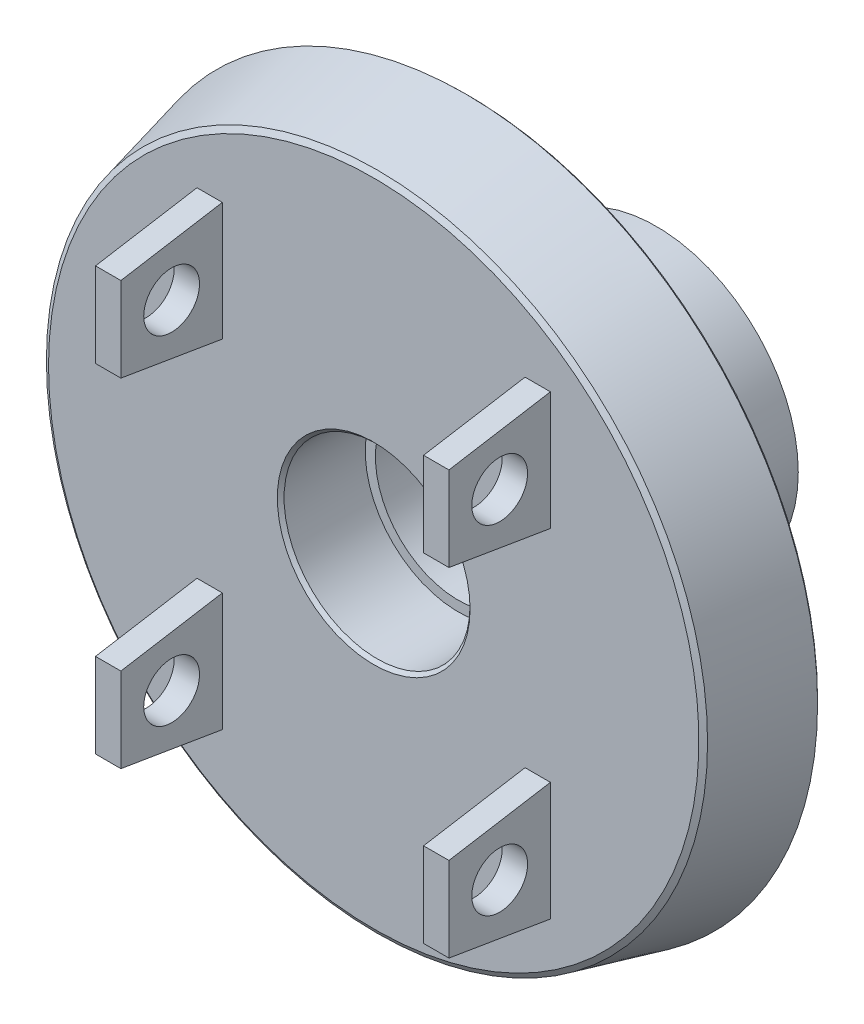
ISO-10303-21;
HEADER;
FILE_DESCRIPTION(('STEP AP214'),'2;1');
FILE_NAME('part.step','',(''),(''),'','','');
FILE_SCHEMA(('AUTOMOTIVE_DESIGN { 1 0 10303 214 1 1 1 1 }'));
ENDSEC;
DATA;
#1=APPLICATION_CONTEXT('core data for automotive mechanical design processes');
#2=APPLICATION_PROTOCOL_DEFINITION('international standard','automotive_design',2000,#1);
#3=PRODUCT_CONTEXT('',#1,'mechanical');
#4=PRODUCT('Part','Part','',(#3));
#5=PRODUCT_RELATED_PRODUCT_CATEGORY('part','',(#4));
#6=PRODUCT_DEFINITION_FORMATION('','',#4);
#7=PRODUCT_DEFINITION_CONTEXT('part definition',#1,'design');
#8=PRODUCT_DEFINITION('design','',#6,#7);
#9=PRODUCT_DEFINITION_SHAPE('','',#8);
#10=(LENGTH_UNIT() NAMED_UNIT(*) SI_UNIT(.MILLI.,.METRE.));
#11=(NAMED_UNIT(*) PLANE_ANGLE_UNIT() SI_UNIT($,.RADIAN.));
#12=(NAMED_UNIT(*) SI_UNIT($,.STERADIAN.) SOLID_ANGLE_UNIT());
#13=UNCERTAINTY_MEASURE_WITH_UNIT(LENGTH_MEASURE(1.E-05),#10,'distance_accuracy_value','');
#14=(GEOMETRIC_REPRESENTATION_CONTEXT(3) GLOBAL_UNCERTAINTY_ASSIGNED_CONTEXT((#13)) GLOBAL_UNIT_ASSIGNED_CONTEXT((#10,
#11,#12)) REPRESENTATION_CONTEXT('',''));
#15=CARTESIAN_POINT('',(0.,0.,0.));
#16=DIRECTION('',(0.,0.,1.));
#17=DIRECTION('',(1.,0.,0.));
#18=AXIS2_PLACEMENT_3D('',#15,#16,#17);
#19=CARTESIAN_POINT('',(5.5,0.,-36.8330847852979));
#20=DIRECTION('',(0.,0.,-1.));
#21=DIRECTION('',(-1.,0.,0.));
#22=AXIS2_PLACEMENT_3D('',#19,#20,#21);
#23=PLANE('',#22);
#24=CARTESIAN_POINT('',(0.,0.,-36.8330847853713));
#25=DIRECTION('',(0.,0.,-1.));
#26=DIRECTION('',(-1.,0.,0.));
#27=AXIS2_PLACEMENT_3D('',#24,#25,#26);
#28=CIRCLE('',#27,5.69999999993342);
#29=CARTESIAN_POINT('',(-5.69999999993342,0.,-36.8330847853713));
#30=VERTEX_POINT('',#29);
#31=EDGE_CURVE('E20',#30,#30,#28,.F.);
#32=ORIENTED_EDGE('',*,*,#31,.T.);
#33=EDGE_LOOP('',(#32));
#34=FACE_BOUND('',#33,.T.);
#35=CARTESIAN_POINT('',(0.,0.,-36.8330847852979));
#36=DIRECTION('',(0.,0.,-1.));
#37=DIRECTION('',(-1.,0.,0.));
#38=AXIS2_PLACEMENT_3D('',#35,#36,#37);
#39=CIRCLE('',#38,8.40813923252621);
#40=CARTESIAN_POINT('',(-8.40813923252621,0.,-36.8330847852979));
#41=VERTEX_POINT('',#40);
#42=EDGE_CURVE('E200',#41,#41,#39,.F.);
#43=ORIENTED_EDGE('',*,*,#42,.F.);
#44=EDGE_LOOP('',(#43));
#45=FACE_BOUND('',#44,.T.);
#46=ADVANCED_FACE('F17',(#34,#45),#23,.T.);
#47=CARTESIAN_POINT('',(0.,0.,-36.8330847853713));
#48=DIRECTION('',(0.,0.,-1.));
#49=DIRECTION('',(-1.,0.,0.));
#50=AXIS2_PLACEMENT_3D('',#47,#48,#49);
#51=CONICAL_SURFACE('',#50,5.69999999993342,0.78539816325534);
#52=ORIENTED_EDGE('',*,*,#31,.F.);
#53=EDGE_LOOP('',(#52));
#54=FACE_BOUND('',#53,.T.);
#55=CARTESIAN_POINT('',(0.,0.,-36.6330847852979));
#56=DIRECTION('',(0.,0.,1.));
#57=DIRECTION('',(1.,0.,0.));
#58=AXIS2_PLACEMENT_3D('',#55,#56,#57);
#59=CIRCLE('',#58,5.5);
#60=CARTESIAN_POINT('',(5.5,0.,-36.6330847852979));
#61=VERTEX_POINT('',#60);
#62=EDGE_CURVE('E196',#61,#61,#59,.T.);
#63=ORIENTED_EDGE('',*,*,#62,.T.);
#64=EDGE_LOOP('',(#63));
#65=FACE_BOUND('',#64,.T.);
#66=ADVANCED_FACE('F271',(#54,#65),#51,.F.);
#67=CARTESIAN_POINT('',(0.,0.,1.84872428862182));
#68=DIRECTION('',(0.,0.,-1.));
#69=DIRECTION('',(-1.,0.,0.));
#70=AXIS2_PLACEMENT_3D('',#67,#68,#69);
#71=CYLINDRICAL_SURFACE('',#70,8.40813923252621);
#72=CARTESIAN_POINT('',(0.,0.,-21.9330847852979));
#73=DIRECTION('',(0.,0.,-1.));
#74=DIRECTION('',(-1.,0.,0.));
#75=AXIS2_PLACEMENT_3D('',#72,#73,#74);
#76=CIRCLE('',#75,8.40813923252621);
#77=CARTESIAN_POINT('',(-8.40813923252621,0.,-21.9330847852979));
#78=VERTEX_POINT('',#77);
#79=EDGE_CURVE('E199',#78,#78,#76,.F.);
#80=ORIENTED_EDGE('',*,*,#79,.F.);
#81=EDGE_LOOP('',(#80));
#82=FACE_BOUND('',#81,.T.);
#83=ORIENTED_EDGE('',*,*,#42,.T.);
#84=EDGE_LOOP('',(#83));
#85=FACE_BOUND('',#84,.T.);
#86=ADVANCED_FACE('F274',(#82,#85),#71,.T.);
#87=CARTESIAN_POINT('',(0.,0.,0.));
#88=DIRECTION('',(0.,0.,1.));
#89=DIRECTION('',(1.,0.,0.));
#90=AXIS2_PLACEMENT_3D('',#87,#88,#89);
#91=CYLINDRICAL_SURFACE('',#90,5.5);
#92=CARTESIAN_POINT('',(0.,0.,-31.8330847852979));
#93=DIRECTION('',(0.,0.,1.));
#94=DIRECTION('',(1.,0.,0.));
#95=AXIS2_PLACEMENT_3D('',#92,#93,#94);
#96=CIRCLE('',#95,5.5);
#97=CARTESIAN_POINT('',(5.5,0.,-31.8330847852979));
#98=VERTEX_POINT('',#97);
#99=EDGE_CURVE('E259',#98,#98,#96,.F.);
#100=ORIENTED_EDGE('',*,*,#99,.F.);
#101=EDGE_LOOP('',(#100));
#102=FACE_BOUND('',#101,.T.);
#103=ORIENTED_EDGE('',*,*,#62,.F.);
#104=EDGE_LOOP('',(#103));
#105=FACE_BOUND('',#104,.T.);
#106=ADVANCED_FACE('F277',(#102,#105),#91,.F.);
#107=CARTESIAN_POINT('',(6.99999999999998,0.,-21.9330847852979));
#108=DIRECTION('',(0.,0.,-1.));
#109=DIRECTION('',(-1.,0.,0.));
#110=AXIS2_PLACEMENT_3D('',#107,#108,#109);
#111=PLANE('',#110);
#112=CARTESIAN_POINT('',(0.,0.,-21.9330847852979));
#113=DIRECTION('',(0.,0.,-1.));
#114=DIRECTION('',(-1.,0.,0.));
#115=AXIS2_PLACEMENT_3D('',#112,#113,#114);
#116=CIRCLE('',#115,18.9);
#117=CARTESIAN_POINT('',(-18.9,0.,-21.9330847852979));
#118=VERTEX_POINT('',#117);
#119=EDGE_CURVE('E256',#118,#118,#116,.T.);
#120=ORIENTED_EDGE('',*,*,#119,.T.);
#121=EDGE_LOOP('',(#120));
#122=FACE_BOUND('',#121,.T.);
#123=ORIENTED_EDGE('',*,*,#79,.T.);
#124=EDGE_LOOP('',(#123));
#125=FACE_BOUND('',#124,.T.);
#126=ADVANCED_FACE('F279',(#122,#125),#111,.T.);
#127=CARTESIAN_POINT('',(5.5,0.,-31.8330847852979));
#128=DIRECTION('',(0.,0.,-1.));
#129=DIRECTION('',(-1.,0.,0.));
#130=AXIS2_PLACEMENT_3D('',#127,#128,#129);
#131=PLANE('',#130);
#132=ORIENTED_EDGE('',*,*,#99,.T.);
#133=EDGE_LOOP('',(#132));
#134=FACE_BOUND('',#133,.T.);
#135=CARTESIAN_POINT('',(0.,0.,-31.8330847852979));
#136=DIRECTION('',(0.,0.,1.));
#137=DIRECTION('',(1.,0.,0.));
#138=AXIS2_PLACEMENT_3D('',#135,#136,#137);
#139=CIRCLE('',#138,4.9);
#140=CARTESIAN_POINT('',(4.9,0.,-31.8330847852979));
#141=VERTEX_POINT('',#140);
#142=EDGE_CURVE('E253',#141,#141,#139,.T.);
#143=ORIENTED_EDGE('',*,*,#142,.T.);
#144=EDGE_LOOP('',(#143));
#145=FACE_BOUND('',#144,.T.);
#146=ADVANCED_FACE('F287',(#134,#145),#131,.T.);
#147=CARTESIAN_POINT('',(0.,0.,-25.7330847852979));
#148=DIRECTION('',(0.,0.,-1.));
#149=DIRECTION('',(-1.,0.,0.));
#150=AXIS2_PLACEMENT_3D('',#147,#148,#149);
#151=CONICAL_SURFACE('',#150,19.85,0.244978663126864);
#152=ORIENTED_EDGE('',*,*,#119,.F.);
#153=EDGE_LOOP('',(#152));
#154=FACE_BOUND('',#153,.T.);
#155=CARTESIAN_POINT('',(0.,0.,-25.7330847852979));
#156=DIRECTION('',(0.,0.,-1.));
#157=DIRECTION('',(-1.,0.,0.));
#158=AXIS2_PLACEMENT_3D('',#155,#156,#157);
#159=CIRCLE('',#158,19.85);
#160=CARTESIAN_POINT('',(-19.85,0.,-25.7330847852979));
#161=VERTEX_POINT('',#160);
#162=EDGE_CURVE('E250',#161,#161,#159,.F.);
#163=ORIENTED_EDGE('',*,*,#162,.F.);
#164=EDGE_LOOP('',(#163));
#165=FACE_BOUND('',#164,.T.);
#166=ADVANCED_FACE('F422',(#154,#165),#151,.F.);
#167=CARTESIAN_POINT('',(0.,0.,0.));
#168=DIRECTION('',(0.,0.,1.));
#169=DIRECTION('',(1.,0.,0.));
#170=AXIS2_PLACEMENT_3D('',#167,#168,#169);
#171=CYLINDRICAL_SURFACE('',#170,4.9);
#172=CARTESIAN_POINT('',(0.,0.,-25.1330847852979));
#173=DIRECTION('',(0.,0.,1.));
#174=DIRECTION('',(1.,0.,0.));
#175=AXIS2_PLACEMENT_3D('',#172,#173,#174);
#176=CIRCLE('',#175,4.9);
#177=CARTESIAN_POINT('',(4.9,0.,-25.1330847852979));
#178=VERTEX_POINT('',#177);
#179=EDGE_CURVE('E247',#178,#178,#176,.F.);
#180=ORIENTED_EDGE('',*,*,#179,.F.);
#181=EDGE_LOOP('',(#180));
#182=FACE_BOUND('',#181,.T.);
#183=ORIENTED_EDGE('',*,*,#142,.F.);
#184=EDGE_LOOP('',(#183));
#185=FACE_BOUND('',#184,.T.);
#186=ADVANCED_FACE('F418',(#182,#185),#171,.F.);
#187=CARTESIAN_POINT('',(19.85,0.,-25.7330847852979));
#188=DIRECTION('',(0.,0.,-1.));
#189=DIRECTION('',(-1.,0.,0.));
#190=AXIS2_PLACEMENT_3D('',#187,#188,#189);
#191=PLANE('',#190);
#192=ORIENTED_EDGE('',*,*,#162,.T.);
#193=EDGE_LOOP('',(#192));
#194=FACE_BOUND('',#193,.T.);
#195=CARTESIAN_POINT('',(0.,0.,-25.7330847852979));
#196=DIRECTION('',(0.,0.,1.));
#197=DIRECTION('',(1.,0.,0.));
#198=AXIS2_PLACEMENT_3D('',#195,#196,#197);
#199=CIRCLE('',#198,20.65);
#200=CARTESIAN_POINT('',(20.65,0.,-25.7330847852979));
#201=VERTEX_POINT('',#200);
#202=EDGE_CURVE('E141',#201,#201,#199,.T.);
#203=ORIENTED_EDGE('',*,*,#202,.F.);
#204=EDGE_LOOP('',(#203));
#205=FACE_BOUND('',#204,.T.);
#206=ADVANCED_FACE('F414',(#194,#205),#191,.T.);
#207=CARTESIAN_POINT('',(4.9,0.,-25.1330847852979));
#208=DIRECTION('',(0.,0.,1.));
#209=DIRECTION('',(1.,0.,0.));
#210=AXIS2_PLACEMENT_3D('',#207,#208,#209);
#211=PLANE('',#210);
#212=ORIENTED_EDGE('',*,*,#179,.T.);
#213=EDGE_LOOP('',(#212));
#214=FACE_BOUND('',#213,.T.);
#215=CARTESIAN_POINT('',(0.,0.,-25.1330847852979));
#216=DIRECTION('',(0.,0.,1.));
#217=DIRECTION('',(1.,0.,0.));
#218=AXIS2_PLACEMENT_3D('',#215,#216,#217);
#219=CIRCLE('',#218,5.5);
#220=CARTESIAN_POINT('',(5.5,0.,-25.1330847852979));
#221=VERTEX_POINT('',#220);
#222=EDGE_CURVE('E174',#221,#221,#219,.T.);
#223=ORIENTED_EDGE('',*,*,#222,.T.);
#224=EDGE_LOOP('',(#223));
#225=FACE_BOUND('',#224,.T.);
#226=ADVANCED_FACE('F410',(#214,#225),#211,.T.);
#227=CARTESIAN_POINT('',(0.,0.,-25.5718823168574));
#228=DIRECTION('',(0.,0.,1.));
#229=DIRECTION('',(1.,0.,0.));
#230=AXIS2_PLACEMENT_3D('',#227,#228,#229);
#231=CONICAL_SURFACE('',#230,20.8112024684405,0.785398163397427);
#232=CARTESIAN_POINT('',(0.,0.,-25.5718823168574));
#233=DIRECTION('',(0.,0.,-1.));
#234=DIRECTION('',(-1.,0.,0.));
#235=AXIS2_PLACEMENT_3D('',#232,#233,#234);
#236=CIRCLE('',#235,20.8112024684405);
#237=CARTESIAN_POINT('',(-20.8112024684405,0.,-25.5718823168574));
#238=VERTEX_POINT('',#237);
#239=EDGE_CURVE('E163',#238,#238,#236,.F.);
#240=ORIENTED_EDGE('',*,*,#239,.F.);
#241=EDGE_LOOP('',(#240));
#242=FACE_BOUND('',#241,.T.);
#243=ORIENTED_EDGE('',*,*,#202,.T.);
#244=EDGE_LOOP('',(#243));
#245=FACE_BOUND('',#244,.T.);
#246=ADVANCED_FACE('F407',(#242,#245),#231,.T.);
#247=CARTESIAN_POINT('',(0.,0.,-14.1330847852979));
#248=DIRECTION('',(0.,0.,-1.));
#249=DIRECTION('',(-1.,0.,0.));
#250=AXIS2_PLACEMENT_3D('',#247,#248,#249);
#251=PLANE('',#250);
#252=DIRECTION('',(0.,1.,0.));
#253=VECTOR('',#252,1.);
#254=CARTESIAN_POINT('',(-8.95,6.5,-14.1330847852979));
#255=LINE('',#254,#253);
#256=CARTESIAN_POINT('',(-8.95,12.5,-14.1330847852979));
#257=VERTEX_POINT('',#256);
#258=CARTESIAN_POINT('',(-8.95,7.5,-14.1330847852979));
#259=VERTEX_POINT('',#258);
#260=EDGE_CURVE('E242',#257,#259,#255,.F.);
#261=ORIENTED_EDGE('',*,*,#260,.F.);
#262=DIRECTION('',(1.,0.,0.));
#263=VECTOR('',#262,1.);
#264=CARTESIAN_POINT('',(20.8122024684405,12.5,-14.1330847852979));
#265=LINE('',#264,#263);
#266=CARTESIAN_POINT('',(-10.45,12.5,-14.1330847852979));
#267=VERTEX_POINT('',#266);
#268=EDGE_CURVE('E126',#267,#257,#265,.T.);
#269=ORIENTED_EDGE('',*,*,#268,.F.);
#270=DIRECTION('',(0.,1.,0.));
#271=VECTOR('',#270,1.);
#272=CARTESIAN_POINT('',(-10.45,6.5,-14.1330847852979));
#273=LINE('',#272,#271);
#274=CARTESIAN_POINT('',(-10.45,7.5,-14.1330847852979));
#275=VERTEX_POINT('',#274);
#276=EDGE_CURVE('E144',#275,#267,#273,.T.);
#277=ORIENTED_EDGE('',*,*,#276,.F.);
#278=DIRECTION('',(1.,0.,0.));
#279=VECTOR('',#278,1.);
#280=CARTESIAN_POINT('',(20.8122024684405,7.5,-14.1330847852979));
#281=LINE('',#280,#279);
#282=EDGE_CURVE('E132',#259,#275,#281,.F.);
#283=ORIENTED_EDGE('',*,*,#282,.F.);
#284=EDGE_LOOP('',(#261,#269,#277,#283));
#285=FACE_BOUND('',#284,.T.);
#286=ADVANCED_FACE('F145',(#285),#251,.F.);
#287=CARTESIAN_POINT('',(20.8122024684405,7.5,-14.1330847852979));
#288=DIRECTION('',(0.,-0.986393923832144,0.164398987305357));
#289=DIRECTION('',(0.,-0.164398987305357,-0.986393923832144));
#290=AXIS2_PLACEMENT_3D('',#287,#288,#289);
#291=PLANE('',#290);
#292=DIRECTION('',(0.,0.164398987305357,0.986393923832144));
#293=VECTOR('',#292,1.);
#294=CARTESIAN_POINT('',(-10.45,6.5,-20.1330847852979));
#295=LINE('',#294,#293);
#296=CARTESIAN_POINT('',(-10.45,6.5,-20.1330847852979));
#297=VERTEX_POINT('',#296);
#298=EDGE_CURVE('E135',#297,#275,#295,.T.);
#299=ORIENTED_EDGE('',*,*,#298,.F.);
#300=DIRECTION('',(1.,0.,0.));
#301=VECTOR('',#300,1.);
#302=CARTESIAN_POINT('',(20.8122024684405,6.5,-20.1330847852979));
#303=LINE('',#302,#301);
#304=CARTESIAN_POINT('',(-8.95,6.5,-20.1330847852979));
#305=VERTEX_POINT('',#304);
#306=EDGE_CURVE('E140',#297,#305,#303,.T.);
#307=ORIENTED_EDGE('',*,*,#306,.T.);
#308=DIRECTION('',(0.,-0.164398987305357,-0.986393923832144));
#309=VECTOR('',#308,1.);
#310=CARTESIAN_POINT('',(-8.95,7.5,-14.1330847852979));
#311=LINE('',#310,#309);
#312=EDGE_CURVE('E138',#259,#305,#311,.T.);
#313=ORIENTED_EDGE('',*,*,#312,.F.);
#314=ORIENTED_EDGE('',*,*,#282,.T.);
#315=EDGE_LOOP('',(#299,#307,#313,#314));
#316=FACE_BOUND('',#315,.T.);
#317=ADVANCED_FACE('F133',(#316),#291,.T.);
#318=CARTESIAN_POINT('',(20.8122024684405,13.5,-20.1330847852979));
#319=DIRECTION('',(0.,0.986393923832144,0.164398987305357));
#320=DIRECTION('',(0.,-0.164398987305357,0.986393923832144));
#321=AXIS2_PLACEMENT_3D('',#318,#319,#320);
#322=PLANE('',#321);
#323=DIRECTION('',(0.,0.164398987305357,-0.986393923832144));
#324=VECTOR('',#323,1.);
#325=CARTESIAN_POINT('',(-10.45,12.5,-14.1330847852979));
#326=LINE('',#325,#324);
#327=CARTESIAN_POINT('',(-10.45,13.5,-20.1330847852979));
#328=VERTEX_POINT('',#327);
#329=EDGE_CURVE('E148',#267,#328,#326,.T.);
#330=ORIENTED_EDGE('',*,*,#329,.F.);
#331=ORIENTED_EDGE('',*,*,#268,.T.);
#332=DIRECTION('',(0.,-0.164398987305357,0.986393923832144));
#333=VECTOR('',#332,1.);
#334=CARTESIAN_POINT('',(-8.95,13.5,-20.1330847852979));
#335=LINE('',#334,#333);
#336=CARTESIAN_POINT('',(-8.95,13.5,-20.1330847852979));
#337=VERTEX_POINT('',#336);
#338=EDGE_CURVE('E238',#337,#257,#335,.T.);
#339=ORIENTED_EDGE('',*,*,#338,.F.);
#340=DIRECTION('',(1.,0.,0.));
#341=VECTOR('',#340,1.);
#342=CARTESIAN_POINT('',(20.8122024684405,13.5,-20.1330847852979));
#343=LINE('',#342,#341);
#344=EDGE_CURVE('E191',#337,#328,#343,.F.);
#345=ORIENTED_EDGE('',*,*,#344,.T.);
#346=EDGE_LOOP('',(#330,#331,#339,#345));
#347=FACE_BOUND('',#346,.T.);
#348=ADVANCED_FACE('F398',(#347),#322,.T.);
#349=CARTESIAN_POINT('',(20.8122024684405,10.,-17.1330847852979));
#350=DIRECTION('',(-1.,0.,0.));
#351=DIRECTION('',(0.,0.,1.));
#352=AXIS2_PLACEMENT_3D('',#349,#350,#351);
#353=CYLINDRICAL_SURFACE('',#352,1.65);
#354=CARTESIAN_POINT('',(-8.95,10.,-17.1330847852979));
#355=DIRECTION('',(-1.,0.,0.));
#356=DIRECTION('',(0.,0.,1.));
#357=AXIS2_PLACEMENT_3D('',#354,#355,#356);
#358=CIRCLE('',#357,1.65);
#359=CARTESIAN_POINT('',(-8.95,10.,-15.4830847852979));
#360=VERTEX_POINT('',#359);
#361=EDGE_CURVE('E234',#360,#360,#358,.T.);
#362=ORIENTED_EDGE('',*,*,#361,.F.);
#363=EDGE_LOOP('',(#362));
#364=FACE_BOUND('',#363,.T.);
#365=CARTESIAN_POINT('',(-10.45,10.,-17.1330847852979));
#366=DIRECTION('',(-1.,0.,0.));
#367=DIRECTION('',(0.,0.,1.));
#368=AXIS2_PLACEMENT_3D('',#365,#366,#367);
#369=CIRCLE('',#368,1.65);
#370=CARTESIAN_POINT('',(-10.45,10.,-15.4830847852979));
#371=VERTEX_POINT('',#370);
#372=EDGE_CURVE('E239',#371,#371,#369,.F.);
#373=ORIENTED_EDGE('',*,*,#372,.F.);
#374=EDGE_LOOP('',(#373));
#375=FACE_BOUND('',#374,.T.);
#376=ADVANCED_FACE('F394',(#364,#375),#353,.F.);
#377=CARTESIAN_POINT('',(0.,0.,-14.1330847852979));
#378=DIRECTION('',(0.,0.,-1.));
#379=DIRECTION('',(-1.,0.,0.));
#380=AXIS2_PLACEMENT_3D('',#377,#378,#379);
#381=PLANE('',#380);
#382=DIRECTION('',(0.,1.,0.));
#383=VECTOR('',#382,1.);
#384=CARTESIAN_POINT('',(8.95,-6.5,-14.1330847852979));
#385=LINE('',#384,#383);
#386=CARTESIAN_POINT('',(8.95,-12.5,-14.1330847852979));
#387=VERTEX_POINT('',#386);
#388=CARTESIAN_POINT('',(8.95,-7.5,-14.1330847852979));
#389=VERTEX_POINT('',#388);
#390=EDGE_CURVE('E232',#387,#389,#385,.T.);
#391=ORIENTED_EDGE('',*,*,#390,.F.);
#392=DIRECTION('',(1.,0.,0.));
#393=VECTOR('',#392,1.);
#394=CARTESIAN_POINT('',(-20.8122024684405,-12.5,-14.1330847852979));
#395=LINE('',#394,#393);
#396=CARTESIAN_POINT('',(10.45,-12.5,-14.1330847852979));
#397=VERTEX_POINT('',#396);
#398=EDGE_CURVE('E181',#397,#387,#395,.F.);
#399=ORIENTED_EDGE('',*,*,#398,.F.);
#400=DIRECTION('',(0.,1.,0.));
#401=VECTOR('',#400,1.);
#402=CARTESIAN_POINT('',(10.45,-6.5,-14.1330847852979));
#403=LINE('',#402,#401);
#404=CARTESIAN_POINT('',(10.45,-7.5,-14.1330847852979));
#405=VERTEX_POINT('',#404);
#406=EDGE_CURVE('E746',#405,#397,#403,.F.);
#407=ORIENTED_EDGE('',*,*,#406,.F.);
#408=DIRECTION('',(1.,0.,0.));
#409=VECTOR('',#408,1.);
#410=CARTESIAN_POINT('',(-20.8122024684405,-7.5,-14.1330847852979));
#411=LINE('',#410,#409);
#412=EDGE_CURVE('E188',#389,#405,#411,.T.);
#413=ORIENTED_EDGE('',*,*,#412,.F.);
#414=EDGE_LOOP('',(#391,#399,#407,#413));
#415=FACE_BOUND('',#414,.T.);
#416=ADVANCED_FACE('F390',(#415),#381,.F.);
#417=CARTESIAN_POINT('',(-20.8122024684405,-7.5,-14.1330847852979));
#418=DIRECTION('',(0.,0.986393923832144,0.164398987305357));
#419=DIRECTION('',(0.,-0.164398987305357,0.986393923832144));
#420=AXIS2_PLACEMENT_3D('',#417,#418,#419);
#421=PLANE('',#420);
#422=DIRECTION('',(0.,-0.164398987305357,0.986393923832144));
#423=VECTOR('',#422,1.);
#424=CARTESIAN_POINT('',(10.45,-6.5,-20.1330847852979));
#425=LINE('',#424,#423);
#426=CARTESIAN_POINT('',(10.45,-6.5,-20.1330847852979));
#427=VERTEX_POINT('',#426);
#428=EDGE_CURVE('E237',#427,#405,#425,.T.);
#429=ORIENTED_EDGE('',*,*,#428,.F.);
#430=DIRECTION('',(1.,0.,0.));
#431=VECTOR('',#430,1.);
#432=CARTESIAN_POINT('',(-20.8122024684405,-6.5,-20.1330847852979));
#433=LINE('',#432,#431);
#434=CARTESIAN_POINT('',(8.95,-6.5,-20.1330847852979));
#435=VERTEX_POINT('',#434);
#436=EDGE_CURVE('E186',#427,#435,#433,.F.);
#437=ORIENTED_EDGE('',*,*,#436,.T.);
#438=DIRECTION('',(0.,0.164398987305357,-0.986393923832144));
#439=VECTOR('',#438,1.);
#440=CARTESIAN_POINT('',(8.95,-7.5,-14.1330847852979));
#441=LINE('',#440,#439);
#442=EDGE_CURVE('E739',#389,#435,#441,.T.);
#443=ORIENTED_EDGE('',*,*,#442,.F.);
#444=ORIENTED_EDGE('',*,*,#412,.T.);
#445=EDGE_LOOP('',(#429,#437,#443,#444));
#446=FACE_BOUND('',#445,.T.);
#447=ADVANCED_FACE('F386',(#446),#421,.T.);
#448=CARTESIAN_POINT('',(-20.8122024684405,-13.5,-20.1330847852979));
#449=DIRECTION('',(0.,-0.986393923832144,0.164398987305357));
#450=DIRECTION('',(0.,-0.164398987305357,-0.986393923832144));
#451=AXIS2_PLACEMENT_3D('',#448,#449,#450);
#452=PLANE('',#451);
#453=DIRECTION('',(0.,-0.164398987305357,-0.986393923832144));
#454=VECTOR('',#453,1.);
#455=CARTESIAN_POINT('',(10.45,-12.5,-14.1330847852979));
#456=LINE('',#455,#454);
#457=CARTESIAN_POINT('',(10.45,-13.5,-20.1330847852979));
#458=VERTEX_POINT('',#457);
#459=EDGE_CURVE('E233',#397,#458,#456,.T.);
#460=ORIENTED_EDGE('',*,*,#459,.F.);
#461=ORIENTED_EDGE('',*,*,#398,.T.);
#462=DIRECTION('',(0.,0.164398987305357,0.986393923832144));
#463=VECTOR('',#462,1.);
#464=CARTESIAN_POINT('',(8.95,-13.5,-20.1330847852979));
#465=LINE('',#464,#463);
#466=CARTESIAN_POINT('',(8.95,-13.5,-20.1330847852979));
#467=VERTEX_POINT('',#466);
#468=EDGE_CURVE('E228',#467,#387,#465,.T.);
#469=ORIENTED_EDGE('',*,*,#468,.F.);
#470=DIRECTION('',(1.,0.,0.));
#471=VECTOR('',#470,1.);
#472=CARTESIAN_POINT('',(-20.8122024684405,-13.5,-20.1330847852979));
#473=LINE('',#472,#471);
#474=EDGE_CURVE('E184',#467,#458,#473,.T.);
#475=ORIENTED_EDGE('',*,*,#474,.T.);
#476=EDGE_LOOP('',(#460,#461,#469,#475));
#477=FACE_BOUND('',#476,.T.);
#478=ADVANCED_FACE('F382',(#477),#452,.T.);
#479=CARTESIAN_POINT('',(-20.8122024684405,-10.,-17.1330847852979));
#480=DIRECTION('',(1.,0.,0.));
#481=DIRECTION('',(0.,0.,-1.));
#482=AXIS2_PLACEMENT_3D('',#479,#480,#481);
#483=CYLINDRICAL_SURFACE('',#482,1.65);
#484=CARTESIAN_POINT('',(8.95,-10.,-17.1330847852979));
#485=DIRECTION('',(1.,0.,0.));
#486=DIRECTION('',(0.,0.,-1.));
#487=AXIS2_PLACEMENT_3D('',#484,#485,#486);
#488=CIRCLE('',#487,1.65);
#489=CARTESIAN_POINT('',(8.95,-10.,-18.7830847852979));
#490=VERTEX_POINT('',#489);
#491=EDGE_CURVE('E225',#490,#490,#488,.T.);
#492=ORIENTED_EDGE('',*,*,#491,.F.);
#493=EDGE_LOOP('',(#492));
#494=FACE_BOUND('',#493,.T.);
#495=CARTESIAN_POINT('',(10.45,-10.,-17.1330847852979));
#496=DIRECTION('',(1.,0.,0.));
#497=DIRECTION('',(0.,0.,-1.));
#498=AXIS2_PLACEMENT_3D('',#495,#496,#497);
#499=CIRCLE('',#498,1.65);
#500=CARTESIAN_POINT('',(10.45,-10.,-18.7830847852979));
#501=VERTEX_POINT('',#500);
#502=EDGE_CURVE('E229',#501,#501,#499,.F.);
#503=ORIENTED_EDGE('',*,*,#502,.F.);
#504=EDGE_LOOP('',(#503));
#505=FACE_BOUND('',#504,.T.);
#506=ADVANCED_FACE('F378',(#494,#505),#483,.F.);
#507=CARTESIAN_POINT('',(-20.8122024684405,10.,-17.1330847852979));
#508=DIRECTION('',(1.,0.,0.));
#509=DIRECTION('',(0.,0.,-1.));
#510=AXIS2_PLACEMENT_3D('',#507,#508,#509);
#511=CYLINDRICAL_SURFACE('',#510,1.65);
#512=CARTESIAN_POINT('',(10.45,10.,-17.1330847852979));
#513=DIRECTION('',(1.,0.,0.));
#514=DIRECTION('',(0.,0.,-1.));
#515=AXIS2_PLACEMENT_3D('',#512,#513,#514);
#516=CIRCLE('',#515,1.65);
#517=CARTESIAN_POINT('',(10.45,10.,-18.7830847852979));
#518=VERTEX_POINT('',#517);
#519=EDGE_CURVE('E221',#518,#518,#516,.T.);
#520=ORIENTED_EDGE('',*,*,#519,.T.);
#521=EDGE_LOOP('',(#520));
#522=FACE_BOUND('',#521,.T.);
#523=CARTESIAN_POINT('',(8.95,10.,-17.1330847852979));
#524=DIRECTION('',(1.,0.,0.));
#525=DIRECTION('',(0.,0.,-1.));
#526=AXIS2_PLACEMENT_3D('',#523,#524,#525);
#527=CIRCLE('',#526,1.65);
#528=CARTESIAN_POINT('',(8.95,10.,-18.7830847852979));
#529=VERTEX_POINT('',#528);
#530=EDGE_CURVE('E216',#529,#529,#527,.F.);
#531=ORIENTED_EDGE('',*,*,#530,.T.);
#532=EDGE_LOOP('',(#531));
#533=FACE_BOUND('',#532,.T.);
#534=ADVANCED_FACE('F374',(#522,#533),#511,.F.);
#535=CARTESIAN_POINT('',(-20.8122024684405,13.5,-20.1330847852979));
#536=DIRECTION('',(0.,-0.986393923832144,-0.164398987305357));
#537=DIRECTION('',(0.,0.164398987305357,-0.986393923832144));
#538=AXIS2_PLACEMENT_3D('',#535,#536,#537);
#539=PLANE('',#538);
#540=DIRECTION('',(-1.,0.,0.));
#541=VECTOR('',#540,1.);
#542=CARTESIAN_POINT('',(0.,12.5,-14.1330847852979));
#543=LINE('',#542,#541);
#544=CARTESIAN_POINT('',(8.95,12.5,-14.1330847852979));
#545=VERTEX_POINT('',#544);
#546=CARTESIAN_POINT('',(10.45,12.5,-14.1330847852979));
#547=VERTEX_POINT('',#546);
#548=EDGE_CURVE('E177',#545,#547,#543,.F.);
#549=ORIENTED_EDGE('',*,*,#548,.T.);
#550=DIRECTION('',(0.,0.164398987305357,-0.986393923832144));
#551=VECTOR('',#550,1.);
#552=CARTESIAN_POINT('',(10.45,12.5,-14.1330847852979));
#553=LINE('',#552,#551);
#554=CARTESIAN_POINT('',(10.45,13.5,-20.1330847852979));
#555=VERTEX_POINT('',#554);
#556=EDGE_CURVE('E224',#547,#555,#553,.T.);
#557=ORIENTED_EDGE('',*,*,#556,.T.);
#558=DIRECTION('',(1.,0.,0.));
#559=VECTOR('',#558,1.);
#560=CARTESIAN_POINT('',(-20.8122024684405,13.5,-20.1330847852979));
#561=LINE('',#560,#559);
#562=CARTESIAN_POINT('',(8.95,13.5,-20.1330847852979));
#563=VERTEX_POINT('',#562);
#564=EDGE_CURVE('E179',#563,#555,#561,.T.);
#565=ORIENTED_EDGE('',*,*,#564,.F.);
#566=DIRECTION('',(0.,-0.164398987305357,0.986393923832144));
#567=VECTOR('',#566,1.);
#568=CARTESIAN_POINT('',(8.95,13.5,-20.1330847852979));
#569=LINE('',#568,#567);
#570=EDGE_CURVE('E219',#563,#545,#569,.T.);
#571=ORIENTED_EDGE('',*,*,#570,.T.);
#572=EDGE_LOOP('',(#549,#557,#565,#571));
#573=FACE_BOUND('',#572,.T.);
#574=ADVANCED_FACE('F370',(#573),#539,.F.);
#575=CARTESIAN_POINT('',(0.,0.,-14.1330847852979));
#576=DIRECTION('',(0.,0.,-1.));
#577=DIRECTION('',(-1.,0.,0.));
#578=AXIS2_PLACEMENT_3D('',#575,#576,#577);
#579=PLANE('',#578);
#580=DIRECTION('',(1.,0.,0.));
#581=VECTOR('',#580,1.);
#582=CARTESIAN_POINT('',(-20.8122024684405,7.5,-14.1330847852979));
#583=LINE('',#582,#581);
#584=CARTESIAN_POINT('',(8.95,7.5,-14.1330847852979));
#585=VERTEX_POINT('',#584);
#586=CARTESIAN_POINT('',(10.45,7.5,-14.1330847852979));
#587=VERTEX_POINT('',#586);
#588=EDGE_CURVE('E175',#585,#587,#583,.T.);
#589=ORIENTED_EDGE('',*,*,#588,.T.);
#590=DIRECTION('',(0.,1.,0.));
#591=VECTOR('',#590,1.);
#592=CARTESIAN_POINT('',(10.45,6.5,-14.1330847852979));
#593=LINE('',#592,#591);
#594=EDGE_CURVE('E220',#587,#547,#593,.T.);
#595=ORIENTED_EDGE('',*,*,#594,.T.);
#596=ORIENTED_EDGE('',*,*,#548,.F.);
#597=DIRECTION('',(0.,1.,0.));
#598=VECTOR('',#597,1.);
#599=CARTESIAN_POINT('',(8.95,6.5,-14.1330847852979));
#600=LINE('',#599,#598);
#601=EDGE_CURVE('E727',#545,#585,#600,.F.);
#602=ORIENTED_EDGE('',*,*,#601,.T.);
#603=EDGE_LOOP('',(#589,#595,#596,#602));
#604=FACE_BOUND('',#603,.T.);
#605=ADVANCED_FACE('F366',(#604),#579,.F.);
#606=CARTESIAN_POINT('',(-20.8122024684405,7.5,-14.1330847852979));
#607=DIRECTION('',(0.,0.986393923832144,-0.164398987305357));
#608=DIRECTION('',(0.,0.164398987305357,0.986393923832144));
#609=AXIS2_PLACEMENT_3D('',#606,#607,#608);
#610=PLANE('',#609);
#611=DIRECTION('',(1.,0.,0.));
#612=VECTOR('',#611,1.);
#613=CARTESIAN_POINT('',(-20.8122024684405,6.5,-20.1330847852979));
#614=LINE('',#613,#612);
#615=CARTESIAN_POINT('',(10.45,6.5,-20.1330847852979));
#616=VERTEX_POINT('',#615);
#617=CARTESIAN_POINT('',(8.95,6.5,-20.1330847852979));
#618=VERTEX_POINT('',#617);
#619=EDGE_CURVE('E172',#616,#618,#614,.F.);
#620=ORIENTED_EDGE('',*,*,#619,.F.);
#621=DIRECTION('',(0.,0.164398987305357,0.986393923832144));
#622=VECTOR('',#621,1.);
#623=CARTESIAN_POINT('',(10.45,6.5,-20.1330847852979));
#624=LINE('',#623,#622);
#625=EDGE_CURVE('E732',#616,#587,#624,.T.);
#626=ORIENTED_EDGE('',*,*,#625,.T.);
#627=ORIENTED_EDGE('',*,*,#588,.F.);
#628=DIRECTION('',(0.,-0.164398987305357,-0.986393923832144));
#629=VECTOR('',#628,1.);
#630=CARTESIAN_POINT('',(8.95,7.5,-14.1330847852979));
#631=LINE('',#630,#629);
#632=EDGE_CURVE('E171',#585,#618,#631,.T.);
#633=ORIENTED_EDGE('',*,*,#632,.T.);
#634=EDGE_LOOP('',(#620,#626,#627,#633));
#635=FACE_BOUND('',#634,.T.);
#636=ADVANCED_FACE('F362',(#635),#610,.F.);
#637=CARTESIAN_POINT('',(0.,0.,0.));
#638=DIRECTION('',(0.,0.,1.));
#639=DIRECTION('',(1.,0.,0.));
#640=AXIS2_PLACEMENT_3D('',#637,#638,#639);
#641=CYLINDRICAL_SURFACE('',#640,5.5);
#642=ORIENTED_EDGE('',*,*,#222,.F.);
#643=EDGE_LOOP('',(#642));
#644=FACE_BOUND('',#643,.T.);
#645=CARTESIAN_POINT('',(0.,0.,-20.3330847852499));
#646=DIRECTION('',(0.,0.,1.));
#647=DIRECTION('',(1.,0.,0.));
#648=AXIS2_PLACEMENT_3D('',#645,#646,#647);
#649=CIRCLE('',#648,5.50000000004047);
#650=CARTESIAN_POINT('',(5.50000000004047,0.,-20.3330847852499));
#651=VERTEX_POINT('',#650);
#652=EDGE_CURVE('E168',#651,#651,#649,.T.);
#653=ORIENTED_EDGE('',*,*,#652,.T.);
#654=EDGE_LOOP('',(#653));
#655=FACE_BOUND('',#654,.T.);
#656=ADVANCED_FACE('F358',(#644,#655),#641,.F.);
#657=CARTESIAN_POINT('',(0.,0.,-25.5718823168574));
#658=DIRECTION('',(0.,0.,-1.));
#659=DIRECTION('',(0.,1.,0.));
#660=AXIS2_PLACEMENT_3D('',#657,#658,#659);
#661=CONICAL_SURFACE('',#660,20.8112024684405,0.2361838678395);
#662=ORIENTED_EDGE('',*,*,#239,.T.);
#663=EDGE_LOOP('',(#662));
#664=FACE_BOUND('',#663,.T.);
#665=CARTESIAN_POINT('',(0.,0.,-20.3275323862108));
#666=DIRECTION('',(0.,0.,-1.));
#667=DIRECTION('',(-1.,0.,0.));
#668=AXIS2_PLACEMENT_3D('',#665,#666,#667);
#669=CIRCLE('',#668,19.5490144020196);
#670=CARTESIAN_POINT('',(-19.5490144020196,0.,-20.3275323862108));
#671=VERTEX_POINT('',#670);
#672=EDGE_CURVE('E164',#671,#671,#669,.F.);
#673=ORIENTED_EDGE('',*,*,#672,.F.);
#674=EDGE_LOOP('',(#673));
#675=FACE_BOUND('',#674,.T.);
#676=ADVANCED_FACE('F354',(#664,#675),#661,.T.);
#677=CARTESIAN_POINT('',(20.8122024684405,-10.,-17.1330847852979));
#678=DIRECTION('',(-1.,0.,0.));
#679=DIRECTION('',(0.,0.,1.));
#680=AXIS2_PLACEMENT_3D('',#677,#678,#679);
#681=CYLINDRICAL_SURFACE('',#680,1.65);
#682=CARTESIAN_POINT('',(-10.45,-10.,-17.1330847852979));
#683=DIRECTION('',(-1.,0.,0.));
#684=DIRECTION('',(0.,0.,1.));
#685=AXIS2_PLACEMENT_3D('',#682,#683,#684);
#686=CIRCLE('',#685,1.65);
#687=CARTESIAN_POINT('',(-10.45,-10.,-15.4830847852979));
#688=VERTEX_POINT('',#687);
#689=EDGE_CURVE('E167',#688,#688,#686,.T.);
#690=ORIENTED_EDGE('',*,*,#689,.T.);
#691=EDGE_LOOP('',(#690));
#692=FACE_BOUND('',#691,.T.);
#693=CARTESIAN_POINT('',(-8.95,-10.,-17.1330847852979));
#694=DIRECTION('',(-1.,0.,0.));
#695=DIRECTION('',(0.,0.,1.));
#696=AXIS2_PLACEMENT_3D('',#693,#694,#695);
#697=CIRCLE('',#696,1.65);
#698=CARTESIAN_POINT('',(-8.95,-10.,-15.4830847852979));
#699=VERTEX_POINT('',#698);
#700=EDGE_CURVE('E208',#699,#699,#697,.F.);
#701=ORIENTED_EDGE('',*,*,#700,.T.);
#702=EDGE_LOOP('',(#701));
#703=FACE_BOUND('',#702,.T.);
#704=ADVANCED_FACE('F350',(#692,#703),#681,.F.);
#705=CARTESIAN_POINT('',(20.8122024684405,-13.5,-20.1330847852979));
#706=DIRECTION('',(0.,0.986393923832144,-0.164398987305357));
#707=DIRECTION('',(0.,0.164398987305357,0.986393923832144));
#708=AXIS2_PLACEMENT_3D('',#705,#706,#707);
#709=PLANE('',#708);
#710=DIRECTION('',(-1.,0.,0.));
#711=VECTOR('',#710,1.);
#712=CARTESIAN_POINT('',(0.,-12.5,-14.1330847852979));
#713=LINE('',#712,#711);
#714=CARTESIAN_POINT('',(-8.95,-12.5,-14.1330847852979));
#715=VERTEX_POINT('',#714);
#716=CARTESIAN_POINT('',(-10.45,-12.5,-14.1330847852979));
#717=VERTEX_POINT('',#716);
#718=EDGE_CURVE('E159',#715,#717,#713,.T.);
#719=ORIENTED_EDGE('',*,*,#718,.T.);
#720=DIRECTION('',(0.,-0.164398987305357,-0.986393923832144));
#721=VECTOR('',#720,1.);
#722=CARTESIAN_POINT('',(-10.45,-12.5,-14.1330847852979));
#723=LINE('',#722,#721);
#724=CARTESIAN_POINT('',(-10.45,-13.5,-20.1330847852979));
#725=VERTEX_POINT('',#724);
#726=EDGE_CURVE('E215',#717,#725,#723,.T.);
#727=ORIENTED_EDGE('',*,*,#726,.T.);
#728=DIRECTION('',(1.,0.,0.));
#729=VECTOR('',#728,1.);
#730=CARTESIAN_POINT('',(20.8122024684405,-13.5,-20.1330847852979));
#731=LINE('',#730,#729);
#732=CARTESIAN_POINT('',(-8.95,-13.5,-20.1330847852979));
#733=VERTEX_POINT('',#732);
#734=EDGE_CURVE('E161',#733,#725,#731,.F.);
#735=ORIENTED_EDGE('',*,*,#734,.F.);
#736=DIRECTION('',(0.,0.164398987305357,0.986393923832144));
#737=VECTOR('',#736,1.);
#738=CARTESIAN_POINT('',(-8.95,-13.5,-20.1330847852979));
#739=LINE('',#738,#737);
#740=EDGE_CURVE('E211',#733,#715,#739,.T.);
#741=ORIENTED_EDGE('',*,*,#740,.T.);
#742=EDGE_LOOP('',(#719,#727,#735,#741));
#743=FACE_BOUND('',#742,.T.);
#744=ADVANCED_FACE('F346',(#743),#709,.F.);
#745=CARTESIAN_POINT('',(0.,0.,-14.1330847852979));
#746=DIRECTION('',(0.,0.,-1.));
#747=DIRECTION('',(-1.,0.,0.));
#748=AXIS2_PLACEMENT_3D('',#745,#746,#747);
#749=PLANE('',#748);
#750=DIRECTION('',(1.,0.,0.));
#751=VECTOR('',#750,1.);
#752=CARTESIAN_POINT('',(20.8122024684405,-7.5,-14.1330847852979));
#753=LINE('',#752,#751);
#754=CARTESIAN_POINT('',(-8.95,-7.5,-14.1330847852979));
#755=VERTEX_POINT('',#754);
#756=CARTESIAN_POINT('',(-10.45,-7.5,-14.1330847852979));
#757=VERTEX_POINT('',#756);
#758=EDGE_CURVE('E154',#755,#757,#753,.F.);
#759=ORIENTED_EDGE('',*,*,#758,.T.);
#760=DIRECTION('',(0.,1.,0.));
#761=VECTOR('',#760,1.);
#762=CARTESIAN_POINT('',(-10.45,-6.5,-14.1330847852979));
#763=LINE('',#762,#761);
#764=EDGE_CURVE('E212',#757,#717,#763,.F.);
#765=ORIENTED_EDGE('',*,*,#764,.T.);
#766=ORIENTED_EDGE('',*,*,#718,.F.);
#767=DIRECTION('',(0.,1.,0.));
#768=VECTOR('',#767,1.);
#769=CARTESIAN_POINT('',(-8.95,-6.5,-14.1330847852979));
#770=LINE('',#769,#768);
#771=EDGE_CURVE('E716',#715,#755,#770,.T.);
#772=ORIENTED_EDGE('',*,*,#771,.T.);
#773=EDGE_LOOP('',(#759,#765,#766,#772));
#774=FACE_BOUND('',#773,.T.);
#775=ADVANCED_FACE('F342',(#774),#749,.F.);
#776=CARTESIAN_POINT('',(20.8122024684405,-7.5,-14.1330847852979));
#777=DIRECTION('',(0.,-0.986393923832144,-0.164398987305357));
#778=DIRECTION('',(0.,0.164398987305357,-0.986393923832144));
#779=AXIS2_PLACEMENT_3D('',#776,#777,#778);
#780=PLANE('',#779);
#781=DIRECTION('',(1.,0.,0.));
#782=VECTOR('',#781,1.);
#783=CARTESIAN_POINT('',(20.8122024684405,-6.5,-20.1330847852979));
#784=LINE('',#783,#782);
#785=CARTESIAN_POINT('',(-10.45,-6.5,-20.1330847852979));
#786=VERTEX_POINT('',#785);
#787=CARTESIAN_POINT('',(-8.95,-6.5,-20.1330847852979));
#788=VERTEX_POINT('',#787);
#789=EDGE_CURVE('E34',#786,#788,#784,.T.);
#790=ORIENTED_EDGE('',*,*,#789,.F.);
#791=DIRECTION('',(0.,-0.164398987305357,0.986393923832144));
#792=VECTOR('',#791,1.);
#793=CARTESIAN_POINT('',(-10.45,-6.5,-20.1330847852979));
#794=LINE('',#793,#792);
#795=EDGE_CURVE('E721',#786,#757,#794,.T.);
#796=ORIENTED_EDGE('',*,*,#795,.T.);
#797=ORIENTED_EDGE('',*,*,#758,.F.);
#798=DIRECTION('',(0.,0.164398987305357,-0.986393923832144));
#799=VECTOR('',#798,1.);
#800=CARTESIAN_POINT('',(-8.95,-7.5,-14.1330847852979));
#801=LINE('',#800,#799);
#802=EDGE_CURVE('E711',#755,#788,#801,.T.);
#803=ORIENTED_EDGE('',*,*,#802,.T.);
#804=EDGE_LOOP('',(#790,#796,#797,#803));
#805=FACE_BOUND('',#804,.T.);
#806=ADVANCED_FACE('F338',(#805),#780,.F.);
#807=CARTESIAN_POINT('',(-10.45,6.5,-14.1330847852979));
#808=DIRECTION('',(-1.,0.,0.));
#809=DIRECTION('',(0.,0.,1.));
#810=AXIS2_PLACEMENT_3D('',#807,#808,#809);
#811=PLANE('',#810);
#812=ORIENTED_EDGE('',*,*,#372,.T.);
#813=EDGE_LOOP('',(#812));
#814=FACE_BOUND('',#813,.T.);
#815=ORIENTED_EDGE('',*,*,#276,.T.);
#816=ORIENTED_EDGE('',*,*,#329,.T.);
#817=DIRECTION('',(0.,1.,0.));
#818=VECTOR('',#817,1.);
#819=CARTESIAN_POINT('',(-10.45,0.,-20.1330847852979));
#820=LINE('',#819,#818);
#821=EDGE_CURVE('E152',#297,#328,#820,.T.);
#822=ORIENTED_EDGE('',*,*,#821,.F.);
#823=ORIENTED_EDGE('',*,*,#298,.T.);
#824=EDGE_LOOP('',(#815,#816,#822,#823));
#825=FACE_BOUND('',#824,.T.);
#826=ADVANCED_FACE('F150',(#814,#825),#811,.T.);
#827=CARTESIAN_POINT('',(-8.95,6.5,-14.1330847852979));
#828=DIRECTION('',(1.,0.,0.));
#829=DIRECTION('',(0.,0.,-1.));
#830=AXIS2_PLACEMENT_3D('',#827,#828,#829);
#831=PLANE('',#830);
#832=ORIENTED_EDGE('',*,*,#361,.T.);
#833=EDGE_LOOP('',(#832));
#834=FACE_BOUND('',#833,.T.);
#835=DIRECTION('',(0.,1.,0.));
#836=VECTOR('',#835,1.);
#837=CARTESIAN_POINT('',(-8.95,0.,-20.1330847852979));
#838=LINE('',#837,#836);
#839=EDGE_CURVE('E703',#337,#305,#838,.F.);
#840=ORIENTED_EDGE('',*,*,#839,.F.);
#841=ORIENTED_EDGE('',*,*,#338,.T.);
#842=ORIENTED_EDGE('',*,*,#260,.T.);
#843=ORIENTED_EDGE('',*,*,#312,.T.);
#844=EDGE_LOOP('',(#840,#841,#842,#843));
#845=FACE_BOUND('',#844,.T.);
#846=ADVANCED_FACE('F331',(#834,#845),#831,.T.);
#847=CARTESIAN_POINT('',(10.45,-6.5,-14.1330847852979));
#848=DIRECTION('',(1.,0.,0.));
#849=DIRECTION('',(0.,0.,-1.));
#850=AXIS2_PLACEMENT_3D('',#847,#848,#849);
#851=PLANE('',#850);
#852=ORIENTED_EDGE('',*,*,#502,.T.);
#853=EDGE_LOOP('',(#852));
#854=FACE_BOUND('',#853,.T.);
#855=ORIENTED_EDGE('',*,*,#406,.T.);
#856=ORIENTED_EDGE('',*,*,#459,.T.);
#857=DIRECTION('',(0.,1.,0.));
#858=VECTOR('',#857,1.);
#859=CARTESIAN_POINT('',(10.45,0.,-20.1330847852979));
#860=LINE('',#859,#858);
#861=EDGE_CURVE('E707',#427,#458,#860,.F.);
#862=ORIENTED_EDGE('',*,*,#861,.F.);
#863=ORIENTED_EDGE('',*,*,#428,.T.);
#864=EDGE_LOOP('',(#855,#856,#862,#863));
#865=FACE_BOUND('',#864,.T.);
#866=ADVANCED_FACE('F327',(#854,#865),#851,.T.);
#867=CARTESIAN_POINT('',(8.95,-6.5,-14.1330847852979));
#868=DIRECTION('',(-1.,0.,0.));
#869=DIRECTION('',(0.,0.,1.));
#870=AXIS2_PLACEMENT_3D('',#867,#868,#869);
#871=PLANE('',#870);
#872=ORIENTED_EDGE('',*,*,#491,.T.);
#873=EDGE_LOOP('',(#872));
#874=FACE_BOUND('',#873,.T.);
#875=DIRECTION('',(0.,1.,0.));
#876=VECTOR('',#875,1.);
#877=CARTESIAN_POINT('',(8.95,0.,-20.1330847852979));
#878=LINE('',#877,#876);
#879=EDGE_CURVE('E700',#467,#435,#878,.T.);
#880=ORIENTED_EDGE('',*,*,#879,.F.);
#881=ORIENTED_EDGE('',*,*,#468,.T.);
#882=ORIENTED_EDGE('',*,*,#390,.T.);
#883=ORIENTED_EDGE('',*,*,#442,.T.);
#884=EDGE_LOOP('',(#880,#881,#882,#883));
#885=FACE_BOUND('',#884,.T.);
#886=ADVANCED_FACE('F323',(#874,#885),#871,.T.);
#887=CARTESIAN_POINT('',(10.45,6.5,-14.1330847852979));
#888=DIRECTION('',(-1.,0.,0.));
#889=DIRECTION('',(0.,0.,1.));
#890=AXIS2_PLACEMENT_3D('',#887,#888,#889);
#891=PLANE('',#890);
#892=ORIENTED_EDGE('',*,*,#625,.F.);
#893=DIRECTION('',(0.,1.,0.));
#894=VECTOR('',#893,1.);
#895=CARTESIAN_POINT('',(10.45,0.,-20.1330847852979));
#896=LINE('',#895,#894);
#897=EDGE_CURVE('E761',#555,#616,#896,.F.);
#898=ORIENTED_EDGE('',*,*,#897,.F.);
#899=ORIENTED_EDGE('',*,*,#556,.F.);
#900=ORIENTED_EDGE('',*,*,#594,.F.);
#901=EDGE_LOOP('',(#892,#898,#899,#900));
#902=FACE_BOUND('',#901,.T.);
#903=ORIENTED_EDGE('',*,*,#519,.F.);
#904=EDGE_LOOP('',(#903));
#905=FACE_BOUND('',#904,.T.);
#906=ADVANCED_FACE('F319',(#902,#905),#891,.F.);
#907=CARTESIAN_POINT('',(8.95,6.5,-14.1330847852979));
#908=DIRECTION('',(1.,0.,0.));
#909=DIRECTION('',(0.,0.,-1.));
#910=AXIS2_PLACEMENT_3D('',#907,#908,#909);
#911=PLANE('',#910);
#912=ORIENTED_EDGE('',*,*,#632,.F.);
#913=ORIENTED_EDGE('',*,*,#601,.F.);
#914=ORIENTED_EDGE('',*,*,#570,.F.);
#915=DIRECTION('',(0.,1.,0.));
#916=VECTOR('',#915,1.);
#917=CARTESIAN_POINT('',(8.95,0.,-20.1330847852979));
#918=LINE('',#917,#916);
#919=EDGE_CURVE('E207',#618,#563,#918,.T.);
#920=ORIENTED_EDGE('',*,*,#919,.F.);
#921=EDGE_LOOP('',(#912,#913,#914,#920));
#922=FACE_BOUND('',#921,.T.);
#923=ORIENTED_EDGE('',*,*,#530,.F.);
#924=EDGE_LOOP('',(#923));
#925=FACE_BOUND('',#924,.T.);
#926=ADVANCED_FACE('F315',(#922,#925),#911,.F.);
#927=CARTESIAN_POINT('',(0.,0.,-20.1330847852432));
#928=DIRECTION('',(0.,0.,1.));
#929=DIRECTION('',(1.,0.,0.));
#930=AXIS2_PLACEMENT_3D('',#927,#928,#929);
#931=CONICAL_SURFACE('',#930,5.70000000004711,0.785398163397448);
#932=ORIENTED_EDGE('',*,*,#652,.F.);
#933=EDGE_LOOP('',(#932));
#934=FACE_BOUND('',#933,.T.);
#935=CARTESIAN_POINT('',(0.,0.,-20.1330847853001));
#936=DIRECTION('',(0.,0.,1.));
#937=DIRECTION('',(1.,0.,0.));
#938=AXIS2_PLACEMENT_3D('',#935,#936,#937);
#939=CIRCLE('',#938,5.69999999999027);
#940=CARTESIAN_POINT('',(5.69999999999027,0.,-20.1330847853001));
#941=VERTEX_POINT('',#940);
#942=EDGE_CURVE('E204',#941,#941,#939,.F.);
#943=ORIENTED_EDGE('',*,*,#942,.F.);
#944=EDGE_LOOP('',(#943));
#945=FACE_BOUND('',#944,.T.);
#946=ADVANCED_FACE('F311',(#934,#945),#931,.F.);
#947=CARTESIAN_POINT('',(0.,0.,-20.3275323862108));
#948=DIRECTION('',(0.,0.,-1.));
#949=DIRECTION('',(-1.,0.,0.));
#950=AXIS2_PLACEMENT_3D('',#947,#948,#949);
#951=CONICAL_SURFACE('',#950,19.5490144020196,1.02158203123695);
#952=ORIENTED_EDGE('',*,*,#672,.T.);
#953=EDGE_LOOP('',(#952));
#954=FACE_BOUND('',#953,.T.);
#955=CARTESIAN_POINT('',(0.,0.,-20.1330847852979));
#956=DIRECTION('',(0.,0.,-1.));
#957=DIRECTION('',(-1.,0.,0.));
#958=AXIS2_PLACEMENT_3D('',#955,#956,#957);
#959=CIRCLE('',#958,19.2313023785218);
#960=CARTESIAN_POINT('',(-19.2313023785218,0.,-20.1330847852979));
#961=VERTEX_POINT('',#960);
#962=EDGE_CURVE('E201',#961,#961,#959,.F.);
#963=ORIENTED_EDGE('',*,*,#962,.F.);
#964=EDGE_LOOP('',(#963));
#965=FACE_BOUND('',#964,.T.);
#966=ADVANCED_FACE('F307',(#954,#965),#951,.T.);
#967=CARTESIAN_POINT('',(-10.45,-6.5,-14.1330847852979));
#968=DIRECTION('',(1.,0.,0.));
#969=DIRECTION('',(0.,0.,-1.));
#970=AXIS2_PLACEMENT_3D('',#967,#968,#969);
#971=PLANE('',#970);
#972=ORIENTED_EDGE('',*,*,#795,.F.);
#973=DIRECTION('',(0.,1.,0.));
#974=VECTOR('',#973,1.);
#975=CARTESIAN_POINT('',(-10.45,0.,-20.1330847852979));
#976=LINE('',#975,#974);
#977=EDGE_CURVE('E26',#725,#786,#976,.T.);
#978=ORIENTED_EDGE('',*,*,#977,.F.);
#979=ORIENTED_EDGE('',*,*,#726,.F.);
#980=ORIENTED_EDGE('',*,*,#764,.F.);
#981=EDGE_LOOP('',(#972,#978,#979,#980));
#982=FACE_BOUND('',#981,.T.);
#983=ORIENTED_EDGE('',*,*,#689,.F.);
#984=EDGE_LOOP('',(#983));
#985=FACE_BOUND('',#984,.T.);
#986=ADVANCED_FACE('F300',(#982,#985),#971,.F.);
#987=CARTESIAN_POINT('',(-8.95,-6.5,-14.1330847852979));
#988=DIRECTION('',(-1.,0.,0.));
#989=DIRECTION('',(0.,0.,1.));
#990=AXIS2_PLACEMENT_3D('',#987,#988,#989);
#991=PLANE('',#990);
#992=ORIENTED_EDGE('',*,*,#802,.F.);
#993=ORIENTED_EDGE('',*,*,#771,.F.);
#994=ORIENTED_EDGE('',*,*,#740,.F.);
#995=DIRECTION('',(0.,1.,0.));
#996=VECTOR('',#995,1.);
#997=CARTESIAN_POINT('',(-8.95,0.,-20.1330847852979));
#998=LINE('',#997,#996);
#999=EDGE_CURVE('E11',#788,#733,#998,.F.);
#1000=ORIENTED_EDGE('',*,*,#999,.F.);
#1001=EDGE_LOOP('',(#992,#993,#994,#1000));
#1002=FACE_BOUND('',#1001,.T.);
#1003=ORIENTED_EDGE('',*,*,#700,.F.);
#1004=EDGE_LOOP('',(#1003));
#1005=FACE_BOUND('',#1004,.T.);
#1006=ADVANCED_FACE('F295',(#1002,#1005),#991,.F.);
#1007=CARTESIAN_POINT('',(5.50000000000001,0.,-20.1330847852979));
#1008=DIRECTION('',(0.,0.,1.));
#1009=DIRECTION('',(1.,0.,0.));
#1010=AXIS2_PLACEMENT_3D('',#1007,#1008,#1009);
#1011=PLANE('',#1010);
#1012=ORIENTED_EDGE('',*,*,#789,.T.);
#1013=ORIENTED_EDGE('',*,*,#999,.T.);
#1014=ORIENTED_EDGE('',*,*,#734,.T.);
#1015=ORIENTED_EDGE('',*,*,#977,.T.);
#1016=EDGE_LOOP('',(#1012,#1013,#1014,#1015));
#1017=FACE_BOUND('',#1016,.T.);
#1018=ORIENTED_EDGE('',*,*,#962,.T.);
#1019=EDGE_LOOP('',(#1018));
#1020=FACE_BOUND('',#1019,.T.);
#1021=ORIENTED_EDGE('',*,*,#942,.T.);
#1022=EDGE_LOOP('',(#1021));
#1023=FACE_BOUND('',#1022,.T.);
#1024=ORIENTED_EDGE('',*,*,#619,.T.);
#1025=ORIENTED_EDGE('',*,*,#919,.T.);
#1026=ORIENTED_EDGE('',*,*,#564,.T.);
#1027=ORIENTED_EDGE('',*,*,#897,.T.);
#1028=EDGE_LOOP('',(#1024,#1025,#1026,#1027));
#1029=FACE_BOUND('',#1028,.T.);
#1030=ORIENTED_EDGE('',*,*,#879,.T.);
#1031=ORIENTED_EDGE('',*,*,#436,.F.);
#1032=ORIENTED_EDGE('',*,*,#861,.T.);
#1033=ORIENTED_EDGE('',*,*,#474,.F.);
#1034=EDGE_LOOP('',(#1030,#1031,#1032,#1033));
#1035=FACE_BOUND('',#1034,.T.);
#1036=ORIENTED_EDGE('',*,*,#839,.T.);
#1037=ORIENTED_EDGE('',*,*,#306,.F.);
#1038=ORIENTED_EDGE('',*,*,#821,.T.);
#1039=ORIENTED_EDGE('',*,*,#344,.F.);
#1040=EDGE_LOOP('',(#1036,#1037,#1038,#1039));
#1041=FACE_BOUND('',#1040,.T.);
#1042=ADVANCED_FACE('F293',(#1017,#1020,#1023,#1029,#1035,#1041),#1011,.T.);
#1043=CLOSED_SHELL('',(#46,#66,#86,#106,#126,#146,#166,#186,#206,#226,#246,#286,#317,#348,#376,
#416,#447,#478,#506,#534,#574,#605,#636,#656,#676,#704,#744,#775,#806,#826,#846,#866,#886,#906,
#926,#946,#966,#986,#1006,#1042));
#1044=MANIFOLD_SOLID_BREP('B1',#1043);
#1045=ADVANCED_BREP_SHAPE_REPRESENTATION('',(#18,#1044),#14);
#1046=SHAPE_DEFINITION_REPRESENTATION(#9,#1045);
ENDSEC;
END-ISO-10303-21;
